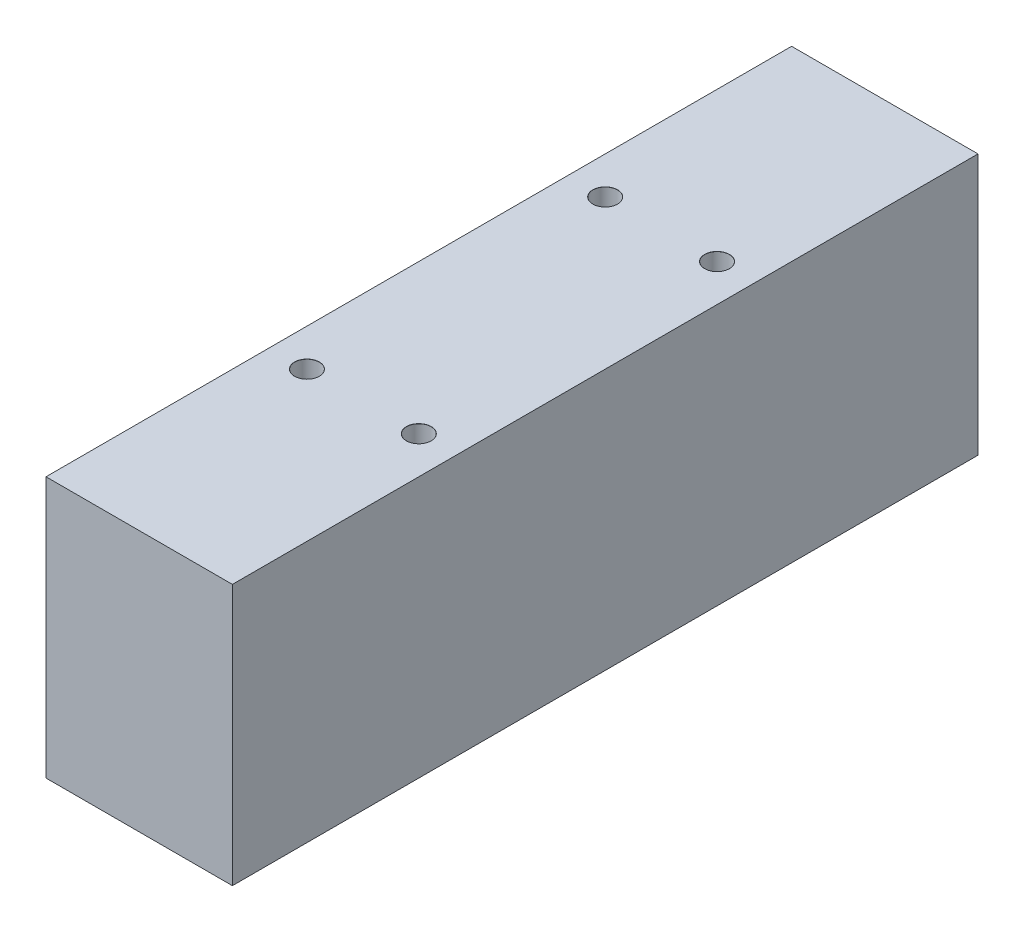
ISO-10303-21;
HEADER;
FILE_DESCRIPTION(('STEP AP214'),'2;1');
FILE_NAME('part.step','',(''),(''),'','','');
FILE_SCHEMA(('AUTOMOTIVE_DESIGN { 1 0 10303 214 1 1 1 1 }'));
ENDSEC;
DATA;
#1=APPLICATION_CONTEXT('core data for automotive mechanical design processes');
#2=APPLICATION_PROTOCOL_DEFINITION('international standard','automotive_design',2000,#1);
#3=PRODUCT_CONTEXT('',#1,'mechanical');
#4=PRODUCT('Part','Part','',(#3));
#5=PRODUCT_RELATED_PRODUCT_CATEGORY('part','',(#4));
#6=PRODUCT_DEFINITION_FORMATION('','',#4);
#7=PRODUCT_DEFINITION_CONTEXT('part definition',#1,'design');
#8=PRODUCT_DEFINITION('design','',#6,#7);
#9=PRODUCT_DEFINITION_SHAPE('','',#8);
#10=(LENGTH_UNIT() NAMED_UNIT(*) SI_UNIT(.MILLI.,.METRE.));
#11=(NAMED_UNIT(*) PLANE_ANGLE_UNIT() SI_UNIT($,.RADIAN.));
#12=(NAMED_UNIT(*) SI_UNIT($,.STERADIAN.) SOLID_ANGLE_UNIT());
#13=UNCERTAINTY_MEASURE_WITH_UNIT(LENGTH_MEASURE(1.E-05),#10,'distance_accuracy_value','');
#14=(GEOMETRIC_REPRESENTATION_CONTEXT(3) GLOBAL_UNCERTAINTY_ASSIGNED_CONTEXT((#13)) GLOBAL_UNIT_ASSIGNED_CONTEXT((#10,
#11,#12)) REPRESENTATION_CONTEXT('',''));
#15=CARTESIAN_POINT('',(0.,0.,0.));
#16=DIRECTION('',(0.,0.,1.));
#17=DIRECTION('',(1.,0.,0.));
#18=AXIS2_PLACEMENT_3D('',#15,#16,#17);
#19=CARTESIAN_POINT('',(25.,70.,-100.));
#20=DIRECTION('',(-1.,0.,0.));
#21=DIRECTION('',(0.,0.,1.));
#22=AXIS2_PLACEMENT_3D('',#19,#20,#21);
#23=PLANE('',#22);
#24=DIRECTION('',(0.,0.,-1.));
#25=VECTOR('',#24,1.);
#26=CARTESIAN_POINT('',(25.,0.,-100.));
#27=LINE('',#26,#25);
#28=CARTESIAN_POINT('',(25.,0.,100.));
#29=VERTEX_POINT('',#28);
#30=CARTESIAN_POINT('',(25.,0.,-100.));
#31=VERTEX_POINT('',#30);
#32=EDGE_CURVE('E145',#29,#31,#27,.T.);
#33=ORIENTED_EDGE('',*,*,#32,.T.);
#34=DIRECTION('',(0.,-1.,0.));
#35=VECTOR('',#34,1.);
#36=CARTESIAN_POINT('',(25.,70.,-100.));
#37=LINE('',#36,#35);
#38=CARTESIAN_POINT('',(25.,70.,-100.));
#39=VERTEX_POINT('',#38);
#40=EDGE_CURVE('E12',#39,#31,#37,.T.);
#41=ORIENTED_EDGE('',*,*,#40,.F.);
#42=DIRECTION('',(0.,0.,-1.));
#43=VECTOR('',#42,1.);
#44=CARTESIAN_POINT('',(25.,70.,-100.));
#45=LINE('',#44,#43);
#46=CARTESIAN_POINT('',(25.,70.,100.));
#47=VERTEX_POINT('',#46);
#48=EDGE_CURVE('E146',#47,#39,#45,.T.);
#49=ORIENTED_EDGE('',*,*,#48,.F.);
#50=DIRECTION('',(0.,-1.,0.));
#51=VECTOR('',#50,1.);
#52=CARTESIAN_POINT('',(25.,70.,100.));
#53=LINE('',#52,#51);
#54=EDGE_CURVE('E156',#47,#29,#53,.T.);
#55=ORIENTED_EDGE('',*,*,#54,.T.);
#56=EDGE_LOOP('',(#33,#41,#49,#55));
#57=FACE_BOUND('',#56,.T.);
#58=ADVANCED_FACE('F44',(#57),#23,.F.);
#59=CARTESIAN_POINT('',(-25.,70.,-100.));
#60=DIRECTION('',(0.,0.,1.));
#61=DIRECTION('',(1.,0.,0.));
#62=AXIS2_PLACEMENT_3D('',#59,#60,#61);
#63=PLANE('',#62);
#64=DIRECTION('',(-1.,0.,0.));
#65=VECTOR('',#64,1.);
#66=CARTESIAN_POINT('',(-25.,0.,-100.));
#67=LINE('',#66,#65);
#68=CARTESIAN_POINT('',(-25.,0.,-100.));
#69=VERTEX_POINT('',#68);
#70=EDGE_CURVE('E160',#31,#69,#67,.T.);
#71=ORIENTED_EDGE('',*,*,#70,.T.);
#72=DIRECTION('',(0.,-1.,0.));
#73=VECTOR('',#72,1.);
#74=CARTESIAN_POINT('',(-25.,70.,-100.));
#75=LINE('',#74,#73);
#76=CARTESIAN_POINT('',(-25.,70.,-100.));
#77=VERTEX_POINT('',#76);
#78=EDGE_CURVE('E53',#77,#69,#75,.T.);
#79=ORIENTED_EDGE('',*,*,#78,.F.);
#80=DIRECTION('',(-1.,0.,0.));
#81=VECTOR('',#80,1.);
#82=CARTESIAN_POINT('',(-25.,70.,-100.));
#83=LINE('',#82,#81);
#84=EDGE_CURVE('E92',#39,#77,#83,.T.);
#85=ORIENTED_EDGE('',*,*,#84,.F.);
#86=ORIENTED_EDGE('',*,*,#40,.T.);
#87=EDGE_LOOP('',(#71,#79,#85,#86));
#88=FACE_BOUND('',#87,.T.);
#89=ADVANCED_FACE('F191',(#88),#63,.F.);
#90=CARTESIAN_POINT('',(-25.,70.,-100.));
#91=DIRECTION('',(1.,0.,0.));
#92=DIRECTION('',(0.,0.,-1.));
#93=AXIS2_PLACEMENT_3D('',#90,#91,#92);
#94=PLANE('',#93);
#95=CARTESIAN_POINT('',(-25.,40.,-60.));
#96=DIRECTION('',(-1.,0.,0.));
#97=DIRECTION('',(0.,0.,1.));
#98=AXIS2_PLACEMENT_3D('',#95,#96,#97);
#99=CIRCLE('',#98,10.);
#100=CARTESIAN_POINT('',(-25.,40.,-50.));
#101=VERTEX_POINT('',#100);
#102=EDGE_CURVE('E537',#101,#101,#99,.T.);
#103=ORIENTED_EDGE('',*,*,#102,.F.);
#104=EDGE_LOOP('',(#103));
#105=FACE_BOUND('',#104,.T.);
#106=CARTESIAN_POINT('',(-25.,40.,60.));
#107=DIRECTION('',(-1.,0.,0.));
#108=DIRECTION('',(0.,0.,1.));
#109=AXIS2_PLACEMENT_3D('',#106,#107,#108);
#110=CIRCLE('',#109,10.);
#111=CARTESIAN_POINT('',(-25.,40.,70.));
#112=VERTEX_POINT('',#111);
#113=EDGE_CURVE('E550',#112,#112,#110,.T.);
#114=ORIENTED_EDGE('',*,*,#113,.F.);
#115=EDGE_LOOP('',(#114));
#116=FACE_BOUND('',#115,.T.);
#117=CARTESIAN_POINT('',(-25.,40.,0.));
#118=DIRECTION('',(-1.,0.,0.));
#119=DIRECTION('',(0.,0.,1.));
#120=AXIS2_PLACEMENT_3D('',#117,#118,#119);
#121=CIRCLE('',#120,18.5);
#122=CARTESIAN_POINT('',(-25.,40.,18.5));
#123=VERTEX_POINT('',#122);
#124=EDGE_CURVE('E540',#123,#123,#121,.T.);
#125=ORIENTED_EDGE('',*,*,#124,.F.);
#126=EDGE_LOOP('',(#125));
#127=FACE_BOUND('',#126,.T.);
#128=DIRECTION('',(0.,0.,1.));
#129=VECTOR('',#128,1.);
#130=CARTESIAN_POINT('',(-25.,0.,-100.));
#131=LINE('',#130,#129);
#132=CARTESIAN_POINT('',(-25.,0.,100.));
#133=VERTEX_POINT('',#132);
#134=EDGE_CURVE('E79',#69,#133,#131,.T.);
#135=ORIENTED_EDGE('',*,*,#134,.T.);
#136=DIRECTION('',(0.,-1.,0.));
#137=VECTOR('',#136,1.);
#138=CARTESIAN_POINT('',(-25.,70.,100.));
#139=LINE('',#138,#137);
#140=CARTESIAN_POINT('',(-25.,70.,100.));
#141=VERTEX_POINT('',#140);
#142=EDGE_CURVE('E169',#141,#133,#139,.T.);
#143=ORIENTED_EDGE('',*,*,#142,.F.);
#144=DIRECTION('',(0.,0.,1.));
#145=VECTOR('',#144,1.);
#146=CARTESIAN_POINT('',(-25.,70.,-100.));
#147=LINE('',#146,#145);
#148=EDGE_CURVE('E151',#77,#141,#147,.T.);
#149=ORIENTED_EDGE('',*,*,#148,.F.);
#150=ORIENTED_EDGE('',*,*,#78,.T.);
#151=EDGE_LOOP('',(#135,#143,#149,#150));
#152=FACE_BOUND('',#151,.T.);
#153=ADVANCED_FACE('F173',(#105,#116,#127,#152),#94,.F.);
#154=CARTESIAN_POINT('',(-25.,70.,100.));
#155=DIRECTION('',(0.,0.,-1.));
#156=DIRECTION('',(-1.,0.,0.));
#157=AXIS2_PLACEMENT_3D('',#154,#155,#156);
#158=PLANE('',#157);
#159=DIRECTION('',(1.,0.,0.));
#160=VECTOR('',#159,1.);
#161=CARTESIAN_POINT('',(-25.,0.,100.));
#162=LINE('',#161,#160);
#163=EDGE_CURVE('E85',#133,#29,#162,.T.);
#164=ORIENTED_EDGE('',*,*,#163,.T.);
#165=ORIENTED_EDGE('',*,*,#54,.F.);
#166=DIRECTION('',(1.,0.,0.));
#167=VECTOR('',#166,1.);
#168=CARTESIAN_POINT('',(-25.,70.,100.));
#169=LINE('',#168,#167);
#170=EDGE_CURVE('E61',#141,#47,#169,.T.);
#171=ORIENTED_EDGE('',*,*,#170,.F.);
#172=ORIENTED_EDGE('',*,*,#142,.T.);
#173=EDGE_LOOP('',(#164,#165,#171,#172));
#174=FACE_BOUND('',#173,.T.);
#175=ADVANCED_FACE('F180',(#174),#158,.F.);
#176=CARTESIAN_POINT('',(0.,70.,0.));
#177=DIRECTION('',(0.,1.,0.));
#178=DIRECTION('',(0.,0.,1.));
#179=AXIS2_PLACEMENT_3D('',#176,#177,#178);
#180=PLANE('',#179);
#181=CARTESIAN_POINT('',(-15.,70.,-40.));
#182=DIRECTION('',(0.,1.,0.));
#183=DIRECTION('',(0.,0.,1.));
#184=AXIS2_PLACEMENT_3D('',#181,#182,#183);
#185=CIRCLE('',#184,3.325);
#186=CARTESIAN_POINT('',(-15.,70.,-36.675));
#187=VERTEX_POINT('',#186);
#188=EDGE_CURVE('E603',#187,#187,#185,.T.);
#189=ORIENTED_EDGE('',*,*,#188,.F.);
#190=EDGE_LOOP('',(#189));
#191=FACE_BOUND('',#190,.T.);
#192=CARTESIAN_POINT('',(15.,70.,-40.));
#193=DIRECTION('',(0.,1.,0.));
#194=DIRECTION('',(0.,0.,1.));
#195=AXIS2_PLACEMENT_3D('',#192,#193,#194);
#196=CIRCLE('',#195,3.325);
#197=CARTESIAN_POINT('',(15.,70.,-36.675));
#198=VERTEX_POINT('',#197);
#199=EDGE_CURVE('E591',#198,#198,#196,.T.);
#200=ORIENTED_EDGE('',*,*,#199,.F.);
#201=EDGE_LOOP('',(#200));
#202=FACE_BOUND('',#201,.T.);
#203=CARTESIAN_POINT('',(-15.,70.,40.));
#204=DIRECTION('',(0.,1.,0.));
#205=DIRECTION('',(0.,0.,1.));
#206=AXIS2_PLACEMENT_3D('',#203,#204,#205);
#207=CIRCLE('',#206,3.325);
#208=CARTESIAN_POINT('',(-15.,70.,43.325));
#209=VERTEX_POINT('',#208);
#210=EDGE_CURVE('E579',#209,#209,#207,.T.);
#211=ORIENTED_EDGE('',*,*,#210,.F.);
#212=EDGE_LOOP('',(#211));
#213=FACE_BOUND('',#212,.T.);
#214=CARTESIAN_POINT('',(15.,70.,40.));
#215=DIRECTION('',(0.,1.,0.));
#216=DIRECTION('',(0.,0.,1.));
#217=AXIS2_PLACEMENT_3D('',#214,#215,#216);
#218=CIRCLE('',#217,3.325);
#219=CARTESIAN_POINT('',(15.,70.,43.325));
#220=VERTEX_POINT('',#219);
#221=EDGE_CURVE('E567',#220,#220,#218,.T.);
#222=ORIENTED_EDGE('',*,*,#221,.F.);
#223=EDGE_LOOP('',(#222));
#224=FACE_BOUND('',#223,.T.);
#225=ORIENTED_EDGE('',*,*,#48,.T.);
#226=ORIENTED_EDGE('',*,*,#84,.T.);
#227=ORIENTED_EDGE('',*,*,#148,.T.);
#228=ORIENTED_EDGE('',*,*,#170,.T.);
#229=EDGE_LOOP('',(#225,#226,#227,#228));
#230=FACE_BOUND('',#229,.T.);
#231=ADVANCED_FACE('F182',(#191,#202,#213,#224,#230),#180,.T.);
#232=CARTESIAN_POINT('',(0.,0.,0.));
#233=DIRECTION('',(0.,1.,0.));
#234=DIRECTION('',(0.,0.,1.));
#235=AXIS2_PLACEMENT_3D('',#232,#233,#234);
#236=PLANE('',#235);
#237=CARTESIAN_POINT('',(-15.,0.,-40.));
#238=DIRECTION('',(0.,1.,0.));
#239=DIRECTION('',(0.,0.,1.));
#240=AXIS2_PLACEMENT_3D('',#237,#238,#239);
#241=CIRCLE('',#240,3.29999999999999);
#242=CARTESIAN_POINT('',(-15.,0.,-36.7));
#243=VERTEX_POINT('',#242);
#244=EDGE_CURVE('E595',#243,#243,#241,.T.);
#245=ORIENTED_EDGE('',*,*,#244,.T.);
#246=EDGE_LOOP('',(#245));
#247=FACE_BOUND('',#246,.T.);
#248=CARTESIAN_POINT('',(15.,0.,-40.));
#249=DIRECTION('',(0.,1.,0.));
#250=DIRECTION('',(0.,0.,1.));
#251=AXIS2_PLACEMENT_3D('',#248,#249,#250);
#252=CIRCLE('',#251,3.29999999999999);
#253=CARTESIAN_POINT('',(15.,0.,-36.7));
#254=VERTEX_POINT('',#253);
#255=EDGE_CURVE('E583',#254,#254,#252,.T.);
#256=ORIENTED_EDGE('',*,*,#255,.T.);
#257=EDGE_LOOP('',(#256));
#258=FACE_BOUND('',#257,.T.);
#259=CARTESIAN_POINT('',(-15.,0.,40.));
#260=DIRECTION('',(0.,1.,0.));
#261=DIRECTION('',(0.,0.,1.));
#262=AXIS2_PLACEMENT_3D('',#259,#260,#261);
#263=CIRCLE('',#262,3.29999999999999);
#264=CARTESIAN_POINT('',(-15.,0.,43.3));
#265=VERTEX_POINT('',#264);
#266=EDGE_CURVE('E571',#265,#265,#263,.T.);
#267=ORIENTED_EDGE('',*,*,#266,.T.);
#268=EDGE_LOOP('',(#267));
#269=FACE_BOUND('',#268,.T.);
#270=CARTESIAN_POINT('',(15.,0.,40.));
#271=DIRECTION('',(0.,1.,0.));
#272=DIRECTION('',(0.,0.,1.));
#273=AXIS2_PLACEMENT_3D('',#270,#271,#272);
#274=CIRCLE('',#273,3.29999999999999);
#275=CARTESIAN_POINT('',(15.,0.,43.3));
#276=VERTEX_POINT('',#275);
#277=EDGE_CURVE('E549',#276,#276,#274,.T.);
#278=ORIENTED_EDGE('',*,*,#277,.T.);
#279=EDGE_LOOP('',(#278));
#280=FACE_BOUND('',#279,.T.);
#281=CARTESIAN_POINT('',(0.,0.,-75.));
#282=DIRECTION('',(0.,-1.,0.));
#283=DIRECTION('',(0.,0.,-1.));
#284=AXIS2_PLACEMENT_3D('',#281,#282,#283);
#285=CIRCLE('',#284,3.325);
#286=CARTESIAN_POINT('',(0.,0.,-78.325));
#287=VERTEX_POINT('',#286);
#288=EDGE_CURVE('E122',#287,#287,#285,.T.);
#289=ORIENTED_EDGE('',*,*,#288,.F.);
#290=EDGE_LOOP('',(#289));
#291=FACE_BOUND('',#290,.T.);
#292=CARTESIAN_POINT('',(0.,0.,0.));
#293=DIRECTION('',(0.,-1.,0.));
#294=DIRECTION('',(0.,0.,-1.));
#295=AXIS2_PLACEMENT_3D('',#292,#293,#294);
#296=CIRCLE('',#295,3.325);
#297=CARTESIAN_POINT('',(0.,0.,-3.325));
#298=VERTEX_POINT('',#297);
#299=EDGE_CURVE('E113',#298,#298,#296,.T.);
#300=ORIENTED_EDGE('',*,*,#299,.F.);
#301=EDGE_LOOP('',(#300));
#302=FACE_BOUND('',#301,.T.);
#303=CARTESIAN_POINT('',(0.,0.,75.));
#304=DIRECTION('',(0.,-1.,0.));
#305=DIRECTION('',(0.,0.,-1.));
#306=AXIS2_PLACEMENT_3D('',#303,#304,#305);
#307=CIRCLE('',#306,3.325);
#308=CARTESIAN_POINT('',(0.,0.,71.675));
#309=VERTEX_POINT('',#308);
#310=EDGE_CURVE('E133',#309,#309,#307,.T.);
#311=ORIENTED_EDGE('',*,*,#310,.F.);
#312=EDGE_LOOP('',(#311));
#313=FACE_BOUND('',#312,.T.);
#314=ORIENTED_EDGE('',*,*,#32,.F.);
#315=ORIENTED_EDGE('',*,*,#163,.F.);
#316=ORIENTED_EDGE('',*,*,#134,.F.);
#317=ORIENTED_EDGE('',*,*,#70,.F.);
#318=EDGE_LOOP('',(#314,#315,#316,#317));
#319=FACE_BOUND('',#318,.T.);
#320=ADVANCED_FACE('F176',(#247,#258,#269,#280,#291,#302,#313,#319),#236,.F.);
#321=CARTESIAN_POINT('',(0.,3.01715995720905,75.));
#322=DIRECTION('',(0.,-1.,0.));
#323=DIRECTION('',(0.,0.,-1.));
#324=AXIS2_PLACEMENT_3D('',#321,#322,#323);
#325=CONICAL_SURFACE('',#324,3.3,1.02974425867665);
#326=CARTESIAN_POINT('',(0.,5.,75.));
#327=VERTEX_POINT('',#326);
#328=VERTEX_LOOP('',#327);
#329=FACE_BOUND('',#328,.T.);
#330=CARTESIAN_POINT('',(0.,3.01715995720905,75.));
#331=DIRECTION('',(0.,-1.,0.));
#332=DIRECTION('',(0.,0.,-1.));
#333=AXIS2_PLACEMENT_3D('',#330,#331,#332);
#334=CIRCLE('',#333,3.3);
#335=CARTESIAN_POINT('',(0.,3.01715995720905,71.7));
#336=VERTEX_POINT('',#335);
#337=EDGE_CURVE('E141',#336,#336,#334,.T.);
#338=ORIENTED_EDGE('',*,*,#337,.T.);
#339=EDGE_LOOP('',(#338));
#340=FACE_BOUND('',#339,.T.);
#341=ADVANCED_FACE('F293',(#329,#340),#325,.F.);
#342=CARTESIAN_POINT('',(0.,0.,75.));
#343=DIRECTION('',(0.,-1.,0.));
#344=DIRECTION('',(0.,0.,-1.));
#345=AXIS2_PLACEMENT_3D('',#342,#343,#344);
#346=CYLINDRICAL_SURFACE('',#345,3.3);
#347=ORIENTED_EDGE('',*,*,#337,.F.);
#348=EDGE_LOOP('',(#347));
#349=FACE_BOUND('',#348,.T.);
#350=CARTESIAN_POINT('',(0.,0.0209774907794346,75.));
#351=DIRECTION('',(0.,-1.,0.));
#352=DIRECTION('',(0.,0.,-1.));
#353=AXIS2_PLACEMENT_3D('',#350,#351,#352);
#354=CIRCLE('',#353,3.3);
#355=CARTESIAN_POINT('',(0.,0.0209774907794346,71.7));
#356=VERTEX_POINT('',#355);
#357=EDGE_CURVE('E137',#356,#356,#354,.T.);
#358=ORIENTED_EDGE('',*,*,#357,.T.);
#359=EDGE_LOOP('',(#358));
#360=FACE_BOUND('',#359,.T.);
#361=ADVANCED_FACE('F450',(#349,#360),#346,.F.);
#362=CARTESIAN_POINT('',(0.,0.,75.));
#363=DIRECTION('',(0.,-1.,0.));
#364=DIRECTION('',(0.,0.,-1.));
#365=AXIS2_PLACEMENT_3D('',#362,#363,#364);
#366=CONICAL_SURFACE('',#365,3.325,0.872664625997118);
#367=ORIENTED_EDGE('',*,*,#357,.F.);
#368=EDGE_LOOP('',(#367));
#369=FACE_BOUND('',#368,.T.);
#370=ORIENTED_EDGE('',*,*,#310,.T.);
#371=EDGE_LOOP('',(#370));
#372=FACE_BOUND('',#371,.T.);
#373=ADVANCED_FACE('F440',(#369,#372),#366,.F.);
#374=CARTESIAN_POINT('',(0.,3.01715995720905,0.));
#375=DIRECTION('',(0.,-1.,0.));
#376=DIRECTION('',(0.,0.,-1.));
#377=AXIS2_PLACEMENT_3D('',#374,#375,#376);
#378=CONICAL_SURFACE('',#377,3.3,1.02974425867665);
#379=CARTESIAN_POINT('',(0.,5.,0.));
#380=VERTEX_POINT('',#379);
#381=VERTEX_LOOP('',#380);
#382=FACE_BOUND('',#381,.T.);
#383=CARTESIAN_POINT('',(0.,3.01715995720905,0.));
#384=DIRECTION('',(0.,-1.,0.));
#385=DIRECTION('',(0.,0.,-1.));
#386=AXIS2_PLACEMENT_3D('',#383,#384,#385);
#387=CIRCLE('',#386,3.3);
#388=CARTESIAN_POINT('',(0.,3.01715995720905,-3.3));
#389=VERTEX_POINT('',#388);
#390=EDGE_CURVE('E129',#389,#389,#387,.T.);
#391=ORIENTED_EDGE('',*,*,#390,.T.);
#392=EDGE_LOOP('',(#391));
#393=FACE_BOUND('',#392,.T.);
#394=ADVANCED_FACE('F430',(#382,#393),#378,.F.);
#395=CARTESIAN_POINT('',(0.,0.,0.));
#396=DIRECTION('',(0.,-1.,0.));
#397=DIRECTION('',(0.,0.,-1.));
#398=AXIS2_PLACEMENT_3D('',#395,#396,#397);
#399=CYLINDRICAL_SURFACE('',#398,3.3);
#400=ORIENTED_EDGE('',*,*,#390,.F.);
#401=EDGE_LOOP('',(#400));
#402=FACE_BOUND('',#401,.T.);
#403=CARTESIAN_POINT('',(0.,0.0209774907794346,0.));
#404=DIRECTION('',(0.,-1.,0.));
#405=DIRECTION('',(0.,0.,-1.));
#406=AXIS2_PLACEMENT_3D('',#403,#404,#405);
#407=CIRCLE('',#406,3.3);
#408=CARTESIAN_POINT('',(0.,0.0209774907794346,-3.3));
#409=VERTEX_POINT('',#408);
#410=EDGE_CURVE('E119',#409,#409,#407,.T.);
#411=ORIENTED_EDGE('',*,*,#410,.T.);
#412=EDGE_LOOP('',(#411));
#413=FACE_BOUND('',#412,.T.);
#414=ADVANCED_FACE('F420',(#402,#413),#399,.F.);
#415=CARTESIAN_POINT('',(0.,0.,0.));
#416=DIRECTION('',(0.,-1.,0.));
#417=DIRECTION('',(0.,0.,-1.));
#418=AXIS2_PLACEMENT_3D('',#415,#416,#417);
#419=CONICAL_SURFACE('',#418,3.325,0.872664625997118);
#420=ORIENTED_EDGE('',*,*,#410,.F.);
#421=EDGE_LOOP('',(#420));
#422=FACE_BOUND('',#421,.T.);
#423=ORIENTED_EDGE('',*,*,#299,.T.);
#424=EDGE_LOOP('',(#423));
#425=FACE_BOUND('',#424,.T.);
#426=ADVANCED_FACE('F106',(#422,#425),#419,.F.);
#427=CARTESIAN_POINT('',(0.,3.01715995720905,-75.));
#428=DIRECTION('',(0.,-1.,0.));
#429=DIRECTION('',(0.,0.,-1.));
#430=AXIS2_PLACEMENT_3D('',#427,#428,#429);
#431=CONICAL_SURFACE('',#430,3.3,1.02974425867665);
#432=CARTESIAN_POINT('',(0.,5.,-75.));
#433=VERTEX_POINT('',#432);
#434=VERTEX_LOOP('',#433);
#435=FACE_BOUND('',#434,.T.);
#436=CARTESIAN_POINT('',(0.,3.01715995720905,-75.));
#437=DIRECTION('',(0.,-1.,0.));
#438=DIRECTION('',(0.,0.,-1.));
#439=AXIS2_PLACEMENT_3D('',#436,#437,#438);
#440=CIRCLE('',#439,3.3);
#441=CARTESIAN_POINT('',(0.,3.01715995720905,-78.3));
#442=VERTEX_POINT('',#441);
#443=EDGE_CURVE('E110',#442,#442,#440,.T.);
#444=ORIENTED_EDGE('',*,*,#443,.T.);
#445=EDGE_LOOP('',(#444));
#446=FACE_BOUND('',#445,.T.);
#447=ADVANCED_FACE('F102',(#435,#446),#431,.F.);
#448=CARTESIAN_POINT('',(0.,0.,-75.));
#449=DIRECTION('',(0.,-1.,0.));
#450=DIRECTION('',(0.,0.,-1.));
#451=AXIS2_PLACEMENT_3D('',#448,#449,#450);
#452=CYLINDRICAL_SURFACE('',#451,3.3);
#453=ORIENTED_EDGE('',*,*,#443,.F.);
#454=EDGE_LOOP('',(#453));
#455=FACE_BOUND('',#454,.T.);
#456=CARTESIAN_POINT('',(0.,0.0209774907794346,-75.));
#457=DIRECTION('',(0.,-1.,0.));
#458=DIRECTION('',(0.,0.,-1.));
#459=AXIS2_PLACEMENT_3D('',#456,#457,#458);
#460=CIRCLE('',#459,3.3);
#461=CARTESIAN_POINT('',(0.,0.0209774907794346,-78.3));
#462=VERTEX_POINT('',#461);
#463=EDGE_CURVE('E114',#462,#462,#460,.T.);
#464=ORIENTED_EDGE('',*,*,#463,.T.);
#465=EDGE_LOOP('',(#464));
#466=FACE_BOUND('',#465,.T.);
#467=ADVANCED_FACE('F105',(#455,#466),#452,.F.);
#468=CARTESIAN_POINT('',(0.,0.,-75.));
#469=DIRECTION('',(0.,-1.,0.));
#470=DIRECTION('',(0.,0.,-1.));
#471=AXIS2_PLACEMENT_3D('',#468,#469,#470);
#472=CONICAL_SURFACE('',#471,3.325,0.872664625997118);
#473=ORIENTED_EDGE('',*,*,#463,.F.);
#474=EDGE_LOOP('',(#473));
#475=FACE_BOUND('',#474,.T.);
#476=ORIENTED_EDGE('',*,*,#288,.T.);
#477=EDGE_LOOP('',(#476));
#478=FACE_BOUND('',#477,.T.);
#479=ADVANCED_FACE('F213',(#475,#478),#472,.F.);
#480=CARTESIAN_POINT('',(77.3259018078045,40.,0.));
#481=DIRECTION('',(-1.,0.,0.));
#482=DIRECTION('',(0.,0.,1.));
#483=AXIS2_PLACEMENT_3D('',#480,#481,#482);
#484=CYLINDRICAL_SURFACE('',#483,18.5);
#485=CARTESIAN_POINT('',(15.,40.,0.));
#486=DIRECTION('',(-1.,0.,0.));
#487=DIRECTION('',(0.,0.,1.));
#488=AXIS2_PLACEMENT_3D('',#485,#486,#487);
#489=CIRCLE('',#488,18.5);
#490=CARTESIAN_POINT('',(15.,40.,18.5));
#491=VERTEX_POINT('',#490);
#492=EDGE_CURVE('E545',#491,#491,#489,.F.);
#493=ORIENTED_EDGE('',*,*,#492,.T.);
#494=EDGE_LOOP('',(#493));
#495=FACE_BOUND('',#494,.T.);
#496=ORIENTED_EDGE('',*,*,#124,.T.);
#497=EDGE_LOOP('',(#496));
#498=FACE_BOUND('',#497,.T.);
#499=ADVANCED_FACE('F218',(#495,#498),#484,.F.);
#500=CARTESIAN_POINT('',(15.,70.,-100.));
#501=DIRECTION('',(-1.,0.,0.));
#502=DIRECTION('',(0.,0.,1.));
#503=AXIS2_PLACEMENT_3D('',#500,#501,#502);
#504=PLANE('',#503);
#505=ORIENTED_EDGE('',*,*,#492,.F.);
#506=EDGE_LOOP('',(#505));
#507=FACE_BOUND('',#506,.T.);
#508=ADVANCED_FACE('F223',(#507),#504,.T.);
#509=CARTESIAN_POINT('',(77.3259018078045,40.,60.));
#510=DIRECTION('',(-1.,0.,0.));
#511=DIRECTION('',(0.,0.,1.));
#512=AXIS2_PLACEMENT_3D('',#509,#510,#511);
#513=CYLINDRICAL_SURFACE('',#512,10.);
#514=CARTESIAN_POINT('',(15.,40.,60.));
#515=DIRECTION('',(-1.,0.,0.));
#516=DIRECTION('',(0.,0.,1.));
#517=AXIS2_PLACEMENT_3D('',#514,#515,#516);
#518=CIRCLE('',#517,10.);
#519=CARTESIAN_POINT('',(15.,40.,70.));
#520=VERTEX_POINT('',#519);
#521=EDGE_CURVE('E544',#520,#520,#518,.F.);
#522=ORIENTED_EDGE('',*,*,#521,.T.);
#523=EDGE_LOOP('',(#522));
#524=FACE_BOUND('',#523,.T.);
#525=ORIENTED_EDGE('',*,*,#113,.T.);
#526=EDGE_LOOP('',(#525));
#527=FACE_BOUND('',#526,.T.);
#528=ADVANCED_FACE('F234',(#524,#527),#513,.F.);
#529=CARTESIAN_POINT('',(15.,70.,-100.));
#530=DIRECTION('',(-1.,0.,0.));
#531=DIRECTION('',(0.,0.,1.));
#532=AXIS2_PLACEMENT_3D('',#529,#530,#531);
#533=PLANE('',#532);
#534=ORIENTED_EDGE('',*,*,#521,.F.);
#535=EDGE_LOOP('',(#534));
#536=FACE_BOUND('',#535,.T.);
#537=ADVANCED_FACE('F245',(#536),#533,.T.);
#538=CARTESIAN_POINT('',(77.3259018078045,40.,-60.));
#539=DIRECTION('',(-1.,0.,0.));
#540=DIRECTION('',(0.,0.,1.));
#541=AXIS2_PLACEMENT_3D('',#538,#539,#540);
#542=CYLINDRICAL_SURFACE('',#541,10.);
#543=CARTESIAN_POINT('',(15.,40.,-60.));
#544=DIRECTION('',(-1.,0.,0.));
#545=DIRECTION('',(0.,0.,1.));
#546=AXIS2_PLACEMENT_3D('',#543,#544,#545);
#547=CIRCLE('',#546,10.);
#548=CARTESIAN_POINT('',(15.,40.,-50.));
#549=VERTEX_POINT('',#548);
#550=EDGE_CURVE('E534',#549,#549,#547,.F.);
#551=ORIENTED_EDGE('',*,*,#550,.T.);
#552=EDGE_LOOP('',(#551));
#553=FACE_BOUND('',#552,.T.);
#554=ORIENTED_EDGE('',*,*,#102,.T.);
#555=EDGE_LOOP('',(#554));
#556=FACE_BOUND('',#555,.T.);
#557=ADVANCED_FACE('F256',(#553,#556),#542,.F.);
#558=CARTESIAN_POINT('',(15.,70.,-100.));
#559=DIRECTION('',(-1.,0.,0.));
#560=DIRECTION('',(0.,0.,1.));
#561=AXIS2_PLACEMENT_3D('',#558,#559,#560);
#562=PLANE('',#561);
#563=ORIENTED_EDGE('',*,*,#550,.F.);
#564=EDGE_LOOP('',(#563));
#565=FACE_BOUND('',#564,.T.);
#566=ADVANCED_FACE('F267',(#565),#562,.T.);
#567=CARTESIAN_POINT('',(15.,70.,40.));
#568=DIRECTION('',(0.,1.,0.));
#569=DIRECTION('',(0.,0.,1.));
#570=AXIS2_PLACEMENT_3D('',#567,#568,#569);
#571=CYLINDRICAL_SURFACE('',#570,3.29999999999999);
#572=ORIENTED_EDGE('',*,*,#277,.F.);
#573=EDGE_LOOP('',(#572));
#574=FACE_BOUND('',#573,.T.);
#575=CARTESIAN_POINT('',(15.,69.9790225092206,40.));
#576=DIRECTION('',(0.,1.,0.));
#577=DIRECTION('',(0.,0.,1.));
#578=AXIS2_PLACEMENT_3D('',#575,#576,#577);
#579=CIRCLE('',#578,3.29999999999999);
#580=CARTESIAN_POINT('',(15.,69.9790225092206,43.3));
#581=VERTEX_POINT('',#580);
#582=EDGE_CURVE('E563',#581,#581,#579,.T.);
#583=ORIENTED_EDGE('',*,*,#582,.T.);
#584=EDGE_LOOP('',(#583));
#585=FACE_BOUND('',#584,.T.);
#586=ADVANCED_FACE('F277',(#574,#585),#571,.F.);
#587=CARTESIAN_POINT('',(15.,70.,40.));
#588=DIRECTION('',(0.,1.,0.));
#589=DIRECTION('',(0.,0.,1.));
#590=AXIS2_PLACEMENT_3D('',#587,#588,#589);
#591=CONICAL_SURFACE('',#590,3.325,0.872664625997282);
#592=ORIENTED_EDGE('',*,*,#582,.F.);
#593=EDGE_LOOP('',(#592));
#594=FACE_BOUND('',#593,.T.);
#595=ORIENTED_EDGE('',*,*,#221,.T.);
#596=EDGE_LOOP('',(#595));
#597=FACE_BOUND('',#596,.T.);
#598=ADVANCED_FACE('F300',(#594,#597),#591,.F.);
#599=CARTESIAN_POINT('',(-15.,70.,40.));
#600=DIRECTION('',(0.,1.,0.));
#601=DIRECTION('',(0.,0.,1.));
#602=AXIS2_PLACEMENT_3D('',#599,#600,#601);
#603=CYLINDRICAL_SURFACE('',#602,3.29999999999999);
#604=ORIENTED_EDGE('',*,*,#266,.F.);
#605=EDGE_LOOP('',(#604));
#606=FACE_BOUND('',#605,.T.);
#607=CARTESIAN_POINT('',(-15.,69.9790225092206,40.));
#608=DIRECTION('',(0.,1.,0.));
#609=DIRECTION('',(0.,0.,1.));
#610=AXIS2_PLACEMENT_3D('',#607,#608,#609);
#611=CIRCLE('',#610,3.29999999999999);
#612=CARTESIAN_POINT('',(-15.,69.9790225092206,43.3));
#613=VERTEX_POINT('',#612);
#614=EDGE_CURVE('E575',#613,#613,#611,.T.);
#615=ORIENTED_EDGE('',*,*,#614,.T.);
#616=EDGE_LOOP('',(#615));
#617=FACE_BOUND('',#616,.T.);
#618=ADVANCED_FACE('F311',(#606,#617),#603,.F.);
#619=CARTESIAN_POINT('',(-15.,70.,40.));
#620=DIRECTION('',(0.,1.,0.));
#621=DIRECTION('',(0.,0.,1.));
#622=AXIS2_PLACEMENT_3D('',#619,#620,#621);
#623=CONICAL_SURFACE('',#622,3.325,0.872664625997316);
#624=ORIENTED_EDGE('',*,*,#614,.F.);
#625=EDGE_LOOP('',(#624));
#626=FACE_BOUND('',#625,.T.);
#627=ORIENTED_EDGE('',*,*,#210,.T.);
#628=EDGE_LOOP('',(#627));
#629=FACE_BOUND('',#628,.T.);
#630=ADVANCED_FACE('F322',(#626,#629),#623,.F.);
#631=CARTESIAN_POINT('',(15.,70.,-40.));
#632=DIRECTION('',(0.,1.,0.));
#633=DIRECTION('',(0.,0.,1.));
#634=AXIS2_PLACEMENT_3D('',#631,#632,#633);
#635=CYLINDRICAL_SURFACE('',#634,3.29999999999999);
#636=ORIENTED_EDGE('',*,*,#255,.F.);
#637=EDGE_LOOP('',(#636));
#638=FACE_BOUND('',#637,.T.);
#639=CARTESIAN_POINT('',(15.,69.9790225092206,-40.));
#640=DIRECTION('',(0.,1.,0.));
#641=DIRECTION('',(0.,0.,1.));
#642=AXIS2_PLACEMENT_3D('',#639,#640,#641);
#643=CIRCLE('',#642,3.29999999999999);
#644=CARTESIAN_POINT('',(15.,69.9790225092206,-36.7));
#645=VERTEX_POINT('',#644);
#646=EDGE_CURVE('E587',#645,#645,#643,.T.);
#647=ORIENTED_EDGE('',*,*,#646,.T.);
#648=EDGE_LOOP('',(#647));
#649=FACE_BOUND('',#648,.T.);
#650=ADVANCED_FACE('F333',(#638,#649),#635,.F.);
#651=CARTESIAN_POINT('',(15.,70.,-40.));
#652=DIRECTION('',(0.,1.,0.));
#653=DIRECTION('',(0.,0.,1.));
#654=AXIS2_PLACEMENT_3D('',#651,#652,#653);
#655=CONICAL_SURFACE('',#654,3.325,0.872664625997282);
#656=ORIENTED_EDGE('',*,*,#646,.F.);
#657=EDGE_LOOP('',(#656));
#658=FACE_BOUND('',#657,.T.);
#659=ORIENTED_EDGE('',*,*,#199,.T.);
#660=EDGE_LOOP('',(#659));
#661=FACE_BOUND('',#660,.T.);
#662=ADVANCED_FACE('F344',(#658,#661),#655,.F.);
#663=CARTESIAN_POINT('',(-15.,70.,-40.));
#664=DIRECTION('',(0.,1.,0.));
#665=DIRECTION('',(0.,0.,1.));
#666=AXIS2_PLACEMENT_3D('',#663,#664,#665);
#667=CYLINDRICAL_SURFACE('',#666,3.29999999999999);
#668=ORIENTED_EDGE('',*,*,#244,.F.);
#669=EDGE_LOOP('',(#668));
#670=FACE_BOUND('',#669,.T.);
#671=CARTESIAN_POINT('',(-15.,69.9790225092206,-40.));
#672=DIRECTION('',(0.,1.,0.));
#673=DIRECTION('',(0.,0.,1.));
#674=AXIS2_PLACEMENT_3D('',#671,#672,#673);
#675=CIRCLE('',#674,3.29999999999999);
#676=CARTESIAN_POINT('',(-15.,69.9790225092206,-36.7));
#677=VERTEX_POINT('',#676);
#678=EDGE_CURVE('E599',#677,#677,#675,.T.);
#679=ORIENTED_EDGE('',*,*,#678,.T.);
#680=EDGE_LOOP('',(#679));
#681=FACE_BOUND('',#680,.T.);
#682=ADVANCED_FACE('F355',(#670,#681),#667,.F.);
#683=CARTESIAN_POINT('',(-15.,70.,-40.));
#684=DIRECTION('',(0.,1.,0.));
#685=DIRECTION('',(0.,0.,1.));
#686=AXIS2_PLACEMENT_3D('',#683,#684,#685);
#687=CONICAL_SURFACE('',#686,3.325,0.872664625997316);
#688=ORIENTED_EDGE('',*,*,#678,.F.);
#689=EDGE_LOOP('',(#688));
#690=FACE_BOUND('',#689,.T.);
#691=ORIENTED_EDGE('',*,*,#188,.T.);
#692=EDGE_LOOP('',(#691));
#693=FACE_BOUND('',#692,.T.);
#694=ADVANCED_FACE('F366',(#690,#693),#687,.F.);
#695=CLOSED_SHELL('',(#58,#89,#153,#175,#231,#320,#341,#361,#373,#394,#414,#426,#447,#467,#479,
#499,#508,#528,#537,#557,#566,#586,#598,#618,#630,#650,#662,#682,#694));
#696=MANIFOLD_SOLID_BREP('B2',#695);
#697=ADVANCED_BREP_SHAPE_REPRESENTATION('',(#18,#696),#14);
#698=SHAPE_DEFINITION_REPRESENTATION(#9,#697);
ENDSEC;
END-ISO-10303-21;
